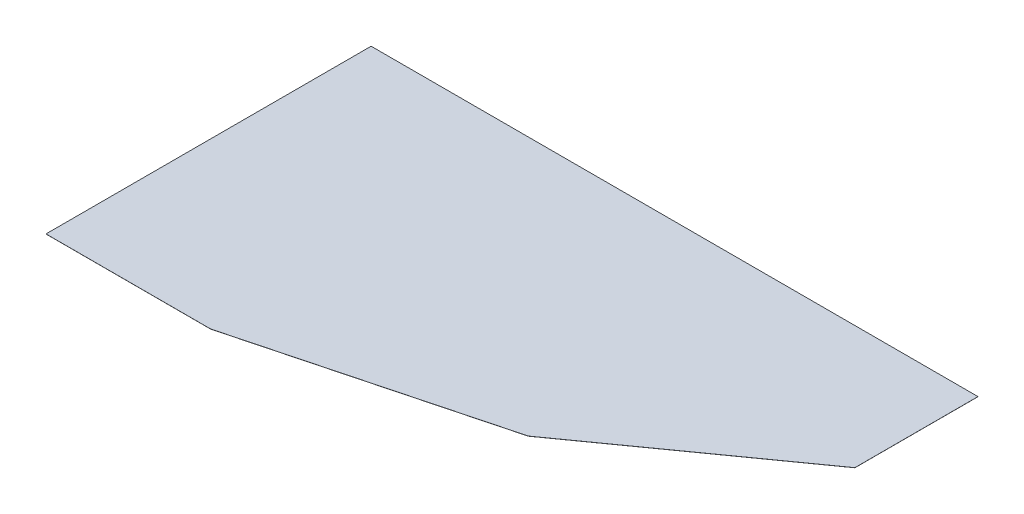
ISO-10303-21;
HEADER;
FILE_DESCRIPTION(('STEP AP214'),'2;1');
FILE_NAME('part.step','',(''),(''),'','','');
FILE_SCHEMA(('AUTOMOTIVE_DESIGN { 1 0 10303 214 1 1 1 1 }'));
ENDSEC;
DATA;
#1=APPLICATION_CONTEXT('core data for automotive mechanical design processes');
#2=APPLICATION_PROTOCOL_DEFINITION('international standard','automotive_design',2000,#1);
#3=PRODUCT_CONTEXT('',#1,'mechanical');
#4=PRODUCT('Part','Part','',(#3));
#5=PRODUCT_RELATED_PRODUCT_CATEGORY('part','',(#4));
#6=PRODUCT_DEFINITION_FORMATION('','',#4);
#7=PRODUCT_DEFINITION_CONTEXT('part definition',#1,'design');
#8=PRODUCT_DEFINITION('design','',#6,#7);
#9=PRODUCT_DEFINITION_SHAPE('','',#8);
#10=(LENGTH_UNIT() NAMED_UNIT(*) SI_UNIT(.MILLI.,.METRE.));
#11=(NAMED_UNIT(*) PLANE_ANGLE_UNIT() SI_UNIT($,.RADIAN.));
#12=(NAMED_UNIT(*) SI_UNIT($,.STERADIAN.) SOLID_ANGLE_UNIT());
#13=UNCERTAINTY_MEASURE_WITH_UNIT(LENGTH_MEASURE(1.E-05),#10,'distance_accuracy_value','');
#14=(GEOMETRIC_REPRESENTATION_CONTEXT(3) GLOBAL_UNCERTAINTY_ASSIGNED_CONTEXT((#13)) GLOBAL_UNIT_ASSIGNED_CONTEXT((#10,
#11,#12)) REPRESENTATION_CONTEXT('',''));
#15=CARTESIAN_POINT('',(0.,0.,0.));
#16=DIRECTION('',(0.,0.,1.));
#17=DIRECTION('',(1.,0.,0.));
#18=AXIS2_PLACEMENT_3D('',#15,#16,#17);
#19=CARTESIAN_POINT('',(0.,0.0125,75.));
#20=DIRECTION('',(1.,0.,0.));
#21=DIRECTION('',(0.,0.,-1.));
#22=AXIS2_PLACEMENT_3D('',#19,#20,#21);
#23=PLANE('',#22);
#24=DIRECTION('',(0.,0.,1.));
#25=VECTOR('',#24,1.);
#26=CARTESIAN_POINT('',(0.,-0.0125,75.));
#27=LINE('',#26,#25);
#28=CARTESIAN_POINT('',(0.,-0.0125,0.));
#29=VERTEX_POINT('',#28);
#30=CARTESIAN_POINT('',(0.,-0.0125,75.));
#31=VERTEX_POINT('',#30);
#32=EDGE_CURVE('E119',#29,#31,#27,.T.);
#33=ORIENTED_EDGE('',*,*,#32,.T.);
#34=DIRECTION('',(0.,-1.,0.));
#35=VECTOR('',#34,1.);
#36=CARTESIAN_POINT('',(0.,0.0125,75.));
#37=LINE('',#36,#35);
#38=CARTESIAN_POINT('',(0.,0.0125,75.));
#39=VERTEX_POINT('',#38);
#40=EDGE_CURVE('E11',#39,#31,#37,.T.);
#41=ORIENTED_EDGE('',*,*,#40,.F.);
#42=DIRECTION('',(0.,0.,1.));
#43=VECTOR('',#42,1.);
#44=CARTESIAN_POINT('',(0.,0.0125,75.));
#45=LINE('',#44,#43);
#46=CARTESIAN_POINT('',(0.,0.0125,0.));
#47=VERTEX_POINT('',#46);
#48=EDGE_CURVE('E129',#47,#39,#45,.T.);
#49=ORIENTED_EDGE('',*,*,#48,.F.);
#50=DIRECTION('',(0.,-1.,0.));
#51=VECTOR('',#50,1.);
#52=CARTESIAN_POINT('',(0.,0.0125,0.));
#53=LINE('',#52,#51);
#54=EDGE_CURVE('E115',#47,#29,#53,.T.);
#55=ORIENTED_EDGE('',*,*,#54,.T.);
#56=EDGE_LOOP('',(#33,#41,#49,#55));
#57=FACE_BOUND('',#56,.T.);
#58=ADVANCED_FACE('F35',(#57),#23,.F.);
#59=CARTESIAN_POINT('',(38.,0.0125,75.));
#60=DIRECTION('',(0.,0.,-1.));
#61=DIRECTION('',(-1.,0.,0.));
#62=AXIS2_PLACEMENT_3D('',#59,#60,#61);
#63=PLANE('',#62);
#64=DIRECTION('',(1.,0.,0.));
#65=VECTOR('',#64,1.);
#66=CARTESIAN_POINT('',(38.,-0.0125,75.));
#67=LINE('',#66,#65);
#68=CARTESIAN_POINT('',(38.,-0.0125,75.));
#69=VERTEX_POINT('',#68);
#70=EDGE_CURVE('E122',#31,#69,#67,.T.);
#71=ORIENTED_EDGE('',*,*,#70,.T.);
#72=DIRECTION('',(0.,-1.,0.));
#73=VECTOR('',#72,1.);
#74=CARTESIAN_POINT('',(38.,0.0125,75.));
#75=LINE('',#74,#73);
#76=CARTESIAN_POINT('',(38.,0.0125,75.));
#77=VERTEX_POINT('',#76);
#78=EDGE_CURVE('E43',#77,#69,#75,.T.);
#79=ORIENTED_EDGE('',*,*,#78,.F.);
#80=DIRECTION('',(1.,0.,0.));
#81=VECTOR('',#80,1.);
#82=CARTESIAN_POINT('',(38.,0.0125,75.));
#83=LINE('',#82,#81);
#84=EDGE_CURVE('E88',#39,#77,#83,.T.);
#85=ORIENTED_EDGE('',*,*,#84,.F.);
#86=ORIENTED_EDGE('',*,*,#40,.T.);
#87=EDGE_LOOP('',(#71,#79,#85,#86));
#88=FACE_BOUND('',#87,.T.);
#89=ADVANCED_FACE('F153',(#88),#63,.F.);
#90=CARTESIAN_POINT('',(96.0281896963839,0.0125,59.7445353869346));
#91=DIRECTION('',(-0.25425774355109,0.,-0.967136494939731));
#92=DIRECTION('',(-0.967136494939731,0.,0.25425774355109));
#93=AXIS2_PLACEMENT_3D('',#90,#91,#92);
#94=PLANE('',#93);
#95=DIRECTION('',(0.967136494939731,0.,-0.25425774355109));
#96=VECTOR('',#95,1.);
#97=CARTESIAN_POINT('',(96.0281896963839,-0.0125,59.7445353869346));
#98=LINE('',#97,#96);
#99=CARTESIAN_POINT('',(96.0281896963839,-0.0125,59.7445353869346));
#100=VERTEX_POINT('',#99);
#101=EDGE_CURVE('E124',#69,#100,#98,.T.);
#102=ORIENTED_EDGE('',*,*,#101,.T.);
#103=DIRECTION('',(0.,-1.,0.));
#104=VECTOR('',#103,1.);
#105=CARTESIAN_POINT('',(96.0281896963839,0.0125,59.7445353869346));
#106=LINE('',#105,#104);
#107=CARTESIAN_POINT('',(96.0281896963839,0.0125,59.7445353869346));
#108=VERTEX_POINT('',#107);
#109=EDGE_CURVE('E110',#108,#100,#106,.T.);
#110=ORIENTED_EDGE('',*,*,#109,.F.);
#111=DIRECTION('',(0.967136494939731,0.,-0.25425774355109));
#112=VECTOR('',#111,1.);
#113=CARTESIAN_POINT('',(96.0281896963839,0.0125,59.7445353869346));
#114=LINE('',#113,#112);
#115=EDGE_CURVE('E101',#77,#108,#114,.T.);
#116=ORIENTED_EDGE('',*,*,#115,.F.);
#117=ORIENTED_EDGE('',*,*,#78,.T.);
#118=EDGE_LOOP('',(#102,#110,#116,#117));
#119=FACE_BOUND('',#118,.T.);
#120=ADVANCED_FACE('F135',(#119),#94,.F.);
#121=CARTESIAN_POINT('',(140.,0.0125,28.4));
#122=DIRECTION('',(-0.580454359017308,0.,-0.814292783400299));
#123=DIRECTION('',(-0.814292783400299,0.,0.580454359017308));
#124=AXIS2_PLACEMENT_3D('',#121,#122,#123);
#125=PLANE('',#124);
#126=DIRECTION('',(0.814292783400299,0.,-0.580454359017308));
#127=VECTOR('',#126,1.);
#128=CARTESIAN_POINT('',(140.,-0.0125,28.4));
#129=LINE('',#128,#127);
#130=CARTESIAN_POINT('',(140.,-0.0125,28.4));
#131=VERTEX_POINT('',#130);
#132=EDGE_CURVE('E109',#100,#131,#129,.T.);
#133=ORIENTED_EDGE('',*,*,#132,.T.);
#134=DIRECTION('',(0.,-1.,0.));
#135=VECTOR('',#134,1.);
#136=CARTESIAN_POINT('',(140.,0.0125,28.4));
#137=LINE('',#136,#135);
#138=CARTESIAN_POINT('',(140.,0.0125,28.4));
#139=VERTEX_POINT('',#138);
#140=EDGE_CURVE('E106',#139,#131,#137,.T.);
#141=ORIENTED_EDGE('',*,*,#140,.F.);
#142=DIRECTION('',(0.814292783400299,0.,-0.580454359017308));
#143=VECTOR('',#142,1.);
#144=CARTESIAN_POINT('',(140.,0.0125,28.4));
#145=LINE('',#144,#143);
#146=EDGE_CURVE('E95',#108,#139,#145,.T.);
#147=ORIENTED_EDGE('',*,*,#146,.F.);
#148=ORIENTED_EDGE('',*,*,#109,.T.);
#149=EDGE_LOOP('',(#133,#141,#147,#148));
#150=FACE_BOUND('',#149,.T.);
#151=ADVANCED_FACE('F107',(#150),#125,.F.);
#152=CARTESIAN_POINT('',(140.,0.0125,0.));
#153=DIRECTION('',(-1.,0.,0.));
#154=DIRECTION('',(0.,0.,1.));
#155=AXIS2_PLACEMENT_3D('',#152,#153,#154);
#156=PLANE('',#155);
#157=DIRECTION('',(0.,0.,-1.));
#158=VECTOR('',#157,1.);
#159=CARTESIAN_POINT('',(140.,-0.0125,0.));
#160=LINE('',#159,#158);
#161=CARTESIAN_POINT('',(140.,-0.0125,0.));
#162=VERTEX_POINT('',#161);
#163=EDGE_CURVE('E74',#131,#162,#160,.T.);
#164=ORIENTED_EDGE('',*,*,#163,.T.);
#165=DIRECTION('',(0.,-1.,0.));
#166=VECTOR('',#165,1.);
#167=CARTESIAN_POINT('',(140.,0.0125,0.));
#168=LINE('',#167,#166);
#169=CARTESIAN_POINT('',(140.,0.0125,0.));
#170=VERTEX_POINT('',#169);
#171=EDGE_CURVE('E111',#170,#162,#168,.T.);
#172=ORIENTED_EDGE('',*,*,#171,.F.);
#173=DIRECTION('',(0.,0.,-1.));
#174=VECTOR('',#173,1.);
#175=CARTESIAN_POINT('',(140.,0.0125,0.));
#176=LINE('',#175,#174);
#177=EDGE_CURVE('E99',#139,#170,#176,.T.);
#178=ORIENTED_EDGE('',*,*,#177,.F.);
#179=ORIENTED_EDGE('',*,*,#140,.T.);
#180=EDGE_LOOP('',(#164,#172,#178,#179));
#181=FACE_BOUND('',#180,.T.);
#182=ADVANCED_FACE('F113',(#181),#156,.F.);
#183=CARTESIAN_POINT('',(0.,0.0125,0.));
#184=DIRECTION('',(0.,0.,1.));
#185=DIRECTION('',(1.,0.,0.));
#186=AXIS2_PLACEMENT_3D('',#183,#184,#185);
#187=PLANE('',#186);
#188=DIRECTION('',(-1.,0.,0.));
#189=VECTOR('',#188,1.);
#190=CARTESIAN_POINT('',(0.,-0.0125,0.));
#191=LINE('',#190,#189);
#192=EDGE_CURVE('E80',#162,#29,#191,.T.);
#193=ORIENTED_EDGE('',*,*,#192,.T.);
#194=ORIENTED_EDGE('',*,*,#54,.F.);
#195=DIRECTION('',(-1.,0.,0.));
#196=VECTOR('',#195,1.);
#197=CARTESIAN_POINT('',(0.,0.0125,0.));
#198=LINE('',#197,#196);
#199=EDGE_CURVE('E51',#170,#47,#198,.T.);
#200=ORIENTED_EDGE('',*,*,#199,.F.);
#201=ORIENTED_EDGE('',*,*,#171,.T.);
#202=EDGE_LOOP('',(#193,#194,#200,#201));
#203=FACE_BOUND('',#202,.T.);
#204=ADVANCED_FACE('F142',(#203),#187,.F.);
#205=CARTESIAN_POINT('',(0.,0.0125,0.));
#206=DIRECTION('',(0.,-1.,0.));
#207=DIRECTION('',(0.,0.,-1.));
#208=AXIS2_PLACEMENT_3D('',#205,#206,#207);
#209=PLANE('',#208);
#210=ORIENTED_EDGE('',*,*,#48,.T.);
#211=ORIENTED_EDGE('',*,*,#84,.T.);
#212=ORIENTED_EDGE('',*,*,#115,.T.);
#213=ORIENTED_EDGE('',*,*,#146,.T.);
#214=ORIENTED_EDGE('',*,*,#177,.T.);
#215=ORIENTED_EDGE('',*,*,#199,.T.);
#216=EDGE_LOOP('',(#210,#211,#212,#213,#214,#215));
#217=FACE_BOUND('',#216,.T.);
#218=ADVANCED_FACE('F97',(#217),#209,.F.);
#219=CARTESIAN_POINT('',(0.,-0.0125,0.));
#220=DIRECTION('',(0.,-1.,0.));
#221=DIRECTION('',(0.,0.,-1.));
#222=AXIS2_PLACEMENT_3D('',#219,#220,#221);
#223=PLANE('',#222);
#224=ORIENTED_EDGE('',*,*,#32,.F.);
#225=ORIENTED_EDGE('',*,*,#192,.F.);
#226=ORIENTED_EDGE('',*,*,#163,.F.);
#227=ORIENTED_EDGE('',*,*,#132,.F.);
#228=ORIENTED_EDGE('',*,*,#101,.F.);
#229=ORIENTED_EDGE('',*,*,#70,.F.);
#230=EDGE_LOOP('',(#224,#225,#226,#227,#228,#229));
#231=FACE_BOUND('',#230,.T.);
#232=ADVANCED_FACE('F138',(#231),#223,.T.);
#233=CLOSED_SHELL('',(#58,#89,#120,#151,#182,#204,#218,#232));
#234=MANIFOLD_SOLID_BREP('B2',#233);
#235=ADVANCED_BREP_SHAPE_REPRESENTATION('',(#18,#234),#14);
#236=SHAPE_DEFINITION_REPRESENTATION(#9,#235);
ENDSEC;
END-ISO-10303-21;
